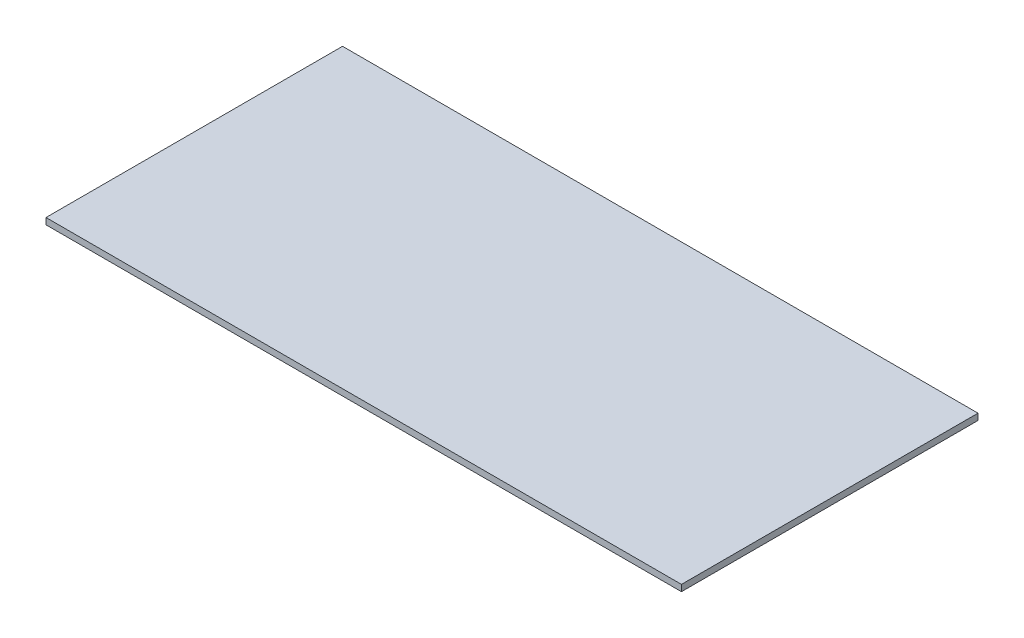
ISO-10303-21;
HEADER;
FILE_DESCRIPTION(('STEP AP214'),'2;1');
FILE_NAME('part.step','',(''),(''),'','','');
FILE_SCHEMA(('AUTOMOTIVE_DESIGN { 1 0 10303 214 1 1 1 1 }'));
ENDSEC;
DATA;
#1=APPLICATION_CONTEXT('core data for automotive mechanical design processes');
#2=APPLICATION_PROTOCOL_DEFINITION('international standard','automotive_design',2000,#1);
#3=PRODUCT_CONTEXT('',#1,'mechanical');
#4=PRODUCT('Part','Part','',(#3));
#5=PRODUCT_RELATED_PRODUCT_CATEGORY('part','',(#4));
#6=PRODUCT_DEFINITION_FORMATION('','',#4);
#7=PRODUCT_DEFINITION_CONTEXT('part definition',#1,'design');
#8=PRODUCT_DEFINITION('design','',#6,#7);
#9=PRODUCT_DEFINITION_SHAPE('','',#8);
#10=(LENGTH_UNIT() NAMED_UNIT(*) SI_UNIT(.MILLI.,.METRE.));
#11=(NAMED_UNIT(*) PLANE_ANGLE_UNIT() SI_UNIT($,.RADIAN.));
#12=(NAMED_UNIT(*) SI_UNIT($,.STERADIAN.) SOLID_ANGLE_UNIT());
#13=UNCERTAINTY_MEASURE_WITH_UNIT(LENGTH_MEASURE(1.E-05),#10,'distance_accuracy_value','');
#14=(GEOMETRIC_REPRESENTATION_CONTEXT(3) GLOBAL_UNCERTAINTY_ASSIGNED_CONTEXT((#13)) GLOBAL_UNIT_ASSIGNED_CONTEXT((#10,
#11,#12)) REPRESENTATION_CONTEXT('',''));
#15=CARTESIAN_POINT('',(0.,0.,0.));
#16=DIRECTION('',(0.,0.,1.));
#17=DIRECTION('',(1.,0.,0.));
#18=AXIS2_PLACEMENT_3D('',#15,#16,#17);
#19=CARTESIAN_POINT('',(300.,6.,-140.));
#20=DIRECTION('',(-1.,0.,0.));
#21=DIRECTION('',(0.,0.,1.));
#22=AXIS2_PLACEMENT_3D('',#19,#20,#21);
#23=PLANE('',#22);
#24=DIRECTION('',(0.,0.,-1.));
#25=VECTOR('',#24,1.);
#26=CARTESIAN_POINT('',(300.,0.,-140.));
#27=LINE('',#26,#25);
#28=CARTESIAN_POINT('',(300.,0.,140.));
#29=VERTEX_POINT('',#28);
#30=CARTESIAN_POINT('',(300.,0.,-140.));
#31=VERTEX_POINT('',#30);
#32=EDGE_CURVE('E102',#29,#31,#27,.T.);
#33=ORIENTED_EDGE('',*,*,#32,.T.);
#34=DIRECTION('',(0.,-1.,0.));
#35=VECTOR('',#34,1.);
#36=CARTESIAN_POINT('',(300.,6.,-140.));
#37=LINE('',#36,#35);
#38=CARTESIAN_POINT('',(300.,6.,-140.));
#39=VERTEX_POINT('',#38);
#40=EDGE_CURVE('E11',#39,#31,#37,.T.);
#41=ORIENTED_EDGE('',*,*,#40,.F.);
#42=DIRECTION('',(0.,0.,-1.));
#43=VECTOR('',#42,1.);
#44=CARTESIAN_POINT('',(300.,6.,-140.));
#45=LINE('',#44,#43);
#46=CARTESIAN_POINT('',(300.,6.,140.));
#47=VERTEX_POINT('',#46);
#48=EDGE_CURVE('E90',#47,#39,#45,.T.);
#49=ORIENTED_EDGE('',*,*,#48,.F.);
#50=DIRECTION('',(0.,-1.,0.));
#51=VECTOR('',#50,1.);
#52=CARTESIAN_POINT('',(300.,6.,140.));
#53=LINE('',#52,#51);
#54=EDGE_CURVE('E98',#47,#29,#53,.T.);
#55=ORIENTED_EDGE('',*,*,#54,.T.);
#56=EDGE_LOOP('',(#33,#41,#49,#55));
#57=FACE_BOUND('',#56,.T.);
#58=ADVANCED_FACE('F39',(#57),#23,.F.);
#59=CARTESIAN_POINT('',(-300.,6.,-140.));
#60=DIRECTION('',(0.,0.,1.));
#61=DIRECTION('',(1.,0.,0.));
#62=AXIS2_PLACEMENT_3D('',#59,#60,#61);
#63=PLANE('',#62);
#64=DIRECTION('',(-1.,0.,0.));
#65=VECTOR('',#64,1.);
#66=CARTESIAN_POINT('',(-300.,0.,-140.));
#67=LINE('',#66,#65);
#68=CARTESIAN_POINT('',(-300.,0.,-140.));
#69=VERTEX_POINT('',#68);
#70=EDGE_CURVE('E94',#31,#69,#67,.T.);
#71=ORIENTED_EDGE('',*,*,#70,.T.);
#72=DIRECTION('',(0.,-1.,0.));
#73=VECTOR('',#72,1.);
#74=CARTESIAN_POINT('',(-300.,6.,-140.));
#75=LINE('',#74,#73);
#76=CARTESIAN_POINT('',(-300.,6.,-140.));
#77=VERTEX_POINT('',#76);
#78=EDGE_CURVE('E47',#77,#69,#75,.T.);
#79=ORIENTED_EDGE('',*,*,#78,.F.);
#80=DIRECTION('',(-1.,0.,0.));
#81=VECTOR('',#80,1.);
#82=CARTESIAN_POINT('',(-300.,6.,-140.));
#83=LINE('',#82,#81);
#84=EDGE_CURVE('E85',#39,#77,#83,.T.);
#85=ORIENTED_EDGE('',*,*,#84,.F.);
#86=ORIENTED_EDGE('',*,*,#40,.T.);
#87=EDGE_LOOP('',(#71,#79,#85,#86));
#88=FACE_BOUND('',#87,.T.);
#89=ADVANCED_FACE('F93',(#88),#63,.F.);
#90=CARTESIAN_POINT('',(-300.,6.,-140.));
#91=DIRECTION('',(1.,0.,0.));
#92=DIRECTION('',(0.,0.,-1.));
#93=AXIS2_PLACEMENT_3D('',#90,#91,#92);
#94=PLANE('',#93);
#95=DIRECTION('',(0.,0.,1.));
#96=VECTOR('',#95,1.);
#97=CARTESIAN_POINT('',(-300.,0.,-140.));
#98=LINE('',#97,#96);
#99=CARTESIAN_POINT('',(-300.,0.,140.));
#100=VERTEX_POINT('',#99);
#101=EDGE_CURVE('E72',#69,#100,#98,.T.);
#102=ORIENTED_EDGE('',*,*,#101,.T.);
#103=DIRECTION('',(0.,-1.,0.));
#104=VECTOR('',#103,1.);
#105=CARTESIAN_POINT('',(-300.,6.,140.));
#106=LINE('',#105,#104);
#107=CARTESIAN_POINT('',(-300.,6.,140.));
#108=VERTEX_POINT('',#107);
#109=EDGE_CURVE('E95',#108,#100,#106,.T.);
#110=ORIENTED_EDGE('',*,*,#109,.F.);
#111=DIRECTION('',(0.,0.,1.));
#112=VECTOR('',#111,1.);
#113=CARTESIAN_POINT('',(-300.,6.,-140.));
#114=LINE('',#113,#112);
#115=EDGE_CURVE('E88',#77,#108,#114,.T.);
#116=ORIENTED_EDGE('',*,*,#115,.F.);
#117=ORIENTED_EDGE('',*,*,#78,.T.);
#118=EDGE_LOOP('',(#102,#110,#116,#117));
#119=FACE_BOUND('',#118,.T.);
#120=ADVANCED_FACE('F96',(#119),#94,.F.);
#121=CARTESIAN_POINT('',(-300.,6.,140.));
#122=DIRECTION('',(0.,0.,-1.));
#123=DIRECTION('',(-1.,0.,0.));
#124=AXIS2_PLACEMENT_3D('',#121,#122,#123);
#125=PLANE('',#124);
#126=DIRECTION('',(1.,0.,0.));
#127=VECTOR('',#126,1.);
#128=CARTESIAN_POINT('',(-300.,0.,140.));
#129=LINE('',#128,#127);
#130=EDGE_CURVE('E78',#100,#29,#129,.T.);
#131=ORIENTED_EDGE('',*,*,#130,.T.);
#132=ORIENTED_EDGE('',*,*,#54,.F.);
#133=DIRECTION('',(1.,0.,0.));
#134=VECTOR('',#133,1.);
#135=CARTESIAN_POINT('',(-300.,6.,140.));
#136=LINE('',#135,#134);
#137=EDGE_CURVE('E55',#108,#47,#136,.T.);
#138=ORIENTED_EDGE('',*,*,#137,.F.);
#139=ORIENTED_EDGE('',*,*,#109,.T.);
#140=EDGE_LOOP('',(#131,#132,#138,#139));
#141=FACE_BOUND('',#140,.T.);
#142=ADVANCED_FACE('F109',(#141),#125,.F.);
#143=CARTESIAN_POINT('',(0.,6.,0.));
#144=DIRECTION('',(0.,1.,0.));
#145=DIRECTION('',(0.,0.,1.));
#146=AXIS2_PLACEMENT_3D('',#143,#144,#145);
#147=PLANE('',#146);
#148=ORIENTED_EDGE('',*,*,#48,.T.);
#149=ORIENTED_EDGE('',*,*,#84,.T.);
#150=ORIENTED_EDGE('',*,*,#115,.T.);
#151=ORIENTED_EDGE('',*,*,#137,.T.);
#152=EDGE_LOOP('',(#148,#149,#150,#151));
#153=FACE_BOUND('',#152,.T.);
#154=ADVANCED_FACE('F86',(#153),#147,.T.);
#155=CARTESIAN_POINT('',(0.,0.,0.));
#156=DIRECTION('',(0.,1.,0.));
#157=DIRECTION('',(0.,0.,1.));
#158=AXIS2_PLACEMENT_3D('',#155,#156,#157);
#159=PLANE('',#158);
#160=ORIENTED_EDGE('',*,*,#32,.F.);
#161=ORIENTED_EDGE('',*,*,#130,.F.);
#162=ORIENTED_EDGE('',*,*,#101,.F.);
#163=ORIENTED_EDGE('',*,*,#70,.F.);
#164=EDGE_LOOP('',(#160,#161,#162,#163));
#165=FACE_BOUND('',#164,.T.);
#166=ADVANCED_FACE('F112',(#165),#159,.F.);
#167=CLOSED_SHELL('',(#58,#89,#120,#142,#154,#166));
#168=MANIFOLD_SOLID_BREP('B2',#167);
#169=ADVANCED_BREP_SHAPE_REPRESENTATION('',(#18,#168),#14);
#170=SHAPE_DEFINITION_REPRESENTATION(#9,#169);
ENDSEC;
END-ISO-10303-21;
